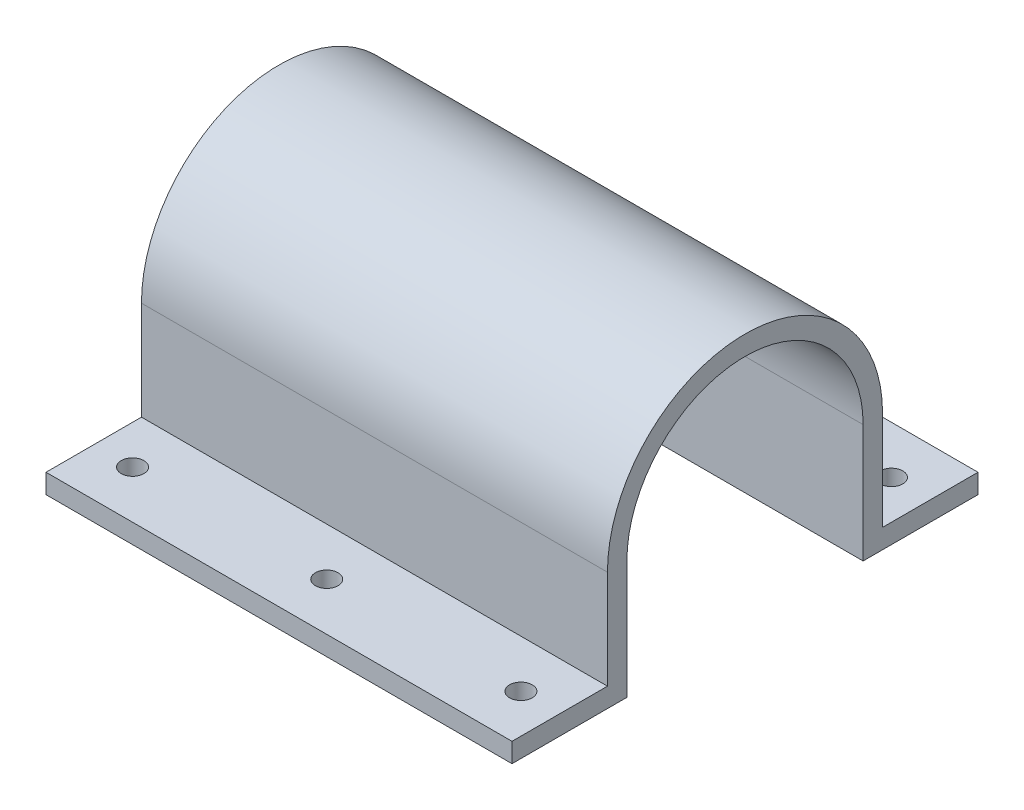
ISO-10303-21;
HEADER;
FILE_DESCRIPTION(('STEP AP214'),'2;1');
FILE_NAME('part.step','',(''),(''),'','','');
FILE_SCHEMA(('AUTOMOTIVE_DESIGN { 1 0 10303 214 1 1 1 1 }'));
ENDSEC;
DATA;
#1=APPLICATION_CONTEXT('core data for automotive mechanical design processes');
#2=APPLICATION_PROTOCOL_DEFINITION('international standard','automotive_design',2000,#1);
#3=PRODUCT_CONTEXT('',#1,'mechanical');
#4=PRODUCT('Part','Part','',(#3));
#5=PRODUCT_RELATED_PRODUCT_CATEGORY('part','',(#4));
#6=PRODUCT_DEFINITION_FORMATION('','',#4);
#7=PRODUCT_DEFINITION_CONTEXT('part definition',#1,'design');
#8=PRODUCT_DEFINITION('design','',#6,#7);
#9=PRODUCT_DEFINITION_SHAPE('','',#8);
#10=(LENGTH_UNIT() NAMED_UNIT(*) SI_UNIT(.MILLI.,.METRE.));
#11=(NAMED_UNIT(*) PLANE_ANGLE_UNIT() SI_UNIT($,.RADIAN.));
#12=(NAMED_UNIT(*) SI_UNIT($,.STERADIAN.) SOLID_ANGLE_UNIT());
#13=UNCERTAINTY_MEASURE_WITH_UNIT(LENGTH_MEASURE(1.E-05),#10,'distance_accuracy_value','');
#14=(GEOMETRIC_REPRESENTATION_CONTEXT(3) GLOBAL_UNCERTAINTY_ASSIGNED_CONTEXT((#13)) GLOBAL_UNIT_ASSIGNED_CONTEXT((#10,
#11,#12)) REPRESENTATION_CONTEXT('',''));
#15=CARTESIAN_POINT('',(0.,0.,0.));
#16=DIRECTION('',(0.,0.,1.));
#17=DIRECTION('',(1.,0.,0.));
#18=AXIS2_PLACEMENT_3D('',#15,#16,#17);
#19=CARTESIAN_POINT('',(72.,0.,18.25));
#20=DIRECTION('',(0.,0.,1.));
#21=DIRECTION('',(0.,-1.,0.));
#22=AXIS2_PLACEMENT_3D('',#19,#20,#21);
#23=PLANE('',#22);
#24=DIRECTION('',(0.,1.,0.));
#25=VECTOR('',#24,1.);
#26=CARTESIAN_POINT('',(3.,-18.25,18.25));
#27=LINE('',#26,#25);
#28=CARTESIAN_POINT('',(3.,-18.25,18.25));
#29=VERTEX_POINT('',#28);
#30=CARTESIAN_POINT('',(3.,0.,18.25));
#31=VERTEX_POINT('',#30);
#32=EDGE_CURVE('E55',#29,#31,#27,.T.);
#33=ORIENTED_EDGE('',*,*,#32,.T.);
#34=DIRECTION('',(-1.,0.,0.));
#35=VECTOR('',#34,1.);
#36=CARTESIAN_POINT('',(72.,0.,18.25));
#37=LINE('',#36,#35);
#38=CARTESIAN_POINT('',(72.,0.,18.25));
#39=VERTEX_POINT('',#38);
#40=EDGE_CURVE('E180',#39,#31,#37,.T.);
#41=ORIENTED_EDGE('',*,*,#40,.F.);
#42=DIRECTION('',(0.,1.,0.));
#43=VECTOR('',#42,1.);
#44=CARTESIAN_POINT('',(72.,0.,18.25));
#45=LINE('',#44,#43);
#46=CARTESIAN_POINT('',(72.,-18.25,18.25));
#47=VERTEX_POINT('',#46);
#48=EDGE_CURVE('E216',#47,#39,#45,.T.);
#49=ORIENTED_EDGE('',*,*,#48,.F.);
#50=DIRECTION('',(-1.,0.,0.));
#51=VECTOR('',#50,1.);
#52=CARTESIAN_POINT('',(72.,-18.25,18.25));
#53=LINE('',#52,#51);
#54=EDGE_CURVE('E51',#47,#29,#53,.T.);
#55=ORIENTED_EDGE('',*,*,#54,.T.);
#56=EDGE_LOOP('',(#33,#41,#49,#55));
#57=FACE_BOUND('',#56,.T.);
#58=ADVANCED_FACE('F36',(#57),#23,.F.);
#59=CARTESIAN_POINT('',(72.,0.,0.));
#60=DIRECTION('',(-1.,0.,0.));
#61=DIRECTION('',(0.,0.,1.));
#62=AXIS2_PLACEMENT_3D('',#59,#60,#61);
#63=CYLINDRICAL_SURFACE('',#62,18.25);
#64=CARTESIAN_POINT('',(3.,0.,0.));
#65=DIRECTION('',(-1.,0.,0.));
#66=DIRECTION('',(0.,0.,1.));
#67=AXIS2_PLACEMENT_3D('',#64,#65,#66);
#68=CIRCLE('',#67,18.25);
#69=CARTESIAN_POINT('',(3.,0.,-18.25));
#70=VERTEX_POINT('',#69);
#71=EDGE_CURVE('E159',#31,#70,#68,.T.);
#72=ORIENTED_EDGE('',*,*,#71,.T.);
#73=DIRECTION('',(-1.,0.,0.));
#74=VECTOR('',#73,1.);
#75=CARTESIAN_POINT('',(72.,0.,-18.25));
#76=LINE('',#75,#74);
#77=CARTESIAN_POINT('',(72.,0.,-18.25));
#78=VERTEX_POINT('',#77);
#79=EDGE_CURVE('E177',#78,#70,#76,.T.);
#80=ORIENTED_EDGE('',*,*,#79,.F.);
#81=CARTESIAN_POINT('',(72.,0.,0.));
#82=DIRECTION('',(-1.,0.,0.));
#83=DIRECTION('',(0.,0.,-1.));
#84=AXIS2_PLACEMENT_3D('',#81,#82,#83);
#85=CIRCLE('',#84,18.25);
#86=EDGE_CURVE('E217',#39,#78,#85,.T.);
#87=ORIENTED_EDGE('',*,*,#86,.F.);
#88=ORIENTED_EDGE('',*,*,#40,.T.);
#89=EDGE_LOOP('',(#72,#80,#87,#88));
#90=FACE_BOUND('',#89,.T.);
#91=ADVANCED_FACE('F221',(#90),#63,.F.);
#92=CARTESIAN_POINT('',(72.,0.,-18.25));
#93=DIRECTION('',(0.,0.,-1.));
#94=DIRECTION('',(0.,1.,0.));
#95=AXIS2_PLACEMENT_3D('',#92,#93,#94);
#96=PLANE('',#95);
#97=DIRECTION('',(0.,-1.,0.));
#98=VECTOR('',#97,1.);
#99=CARTESIAN_POINT('',(3.,0.,-18.25));
#100=LINE('',#99,#98);
#101=CARTESIAN_POINT('',(3.,-18.25,-18.25));
#102=VERTEX_POINT('',#101);
#103=EDGE_CURVE('E226',#70,#102,#100,.T.);
#104=ORIENTED_EDGE('',*,*,#103,.T.);
#105=DIRECTION('',(-1.,0.,0.));
#106=VECTOR('',#105,1.);
#107=CARTESIAN_POINT('',(72.,-18.25,-18.25));
#108=LINE('',#107,#106);
#109=CARTESIAN_POINT('',(72.,-18.25,-18.25));
#110=VERTEX_POINT('',#109);
#111=EDGE_CURVE('E175',#110,#102,#108,.T.);
#112=ORIENTED_EDGE('',*,*,#111,.F.);
#113=DIRECTION('',(0.,-1.,0.));
#114=VECTOR('',#113,1.);
#115=CARTESIAN_POINT('',(72.,0.,-18.25));
#116=LINE('',#115,#114);
#117=EDGE_CURVE('E136',#78,#110,#116,.T.);
#118=ORIENTED_EDGE('',*,*,#117,.F.);
#119=ORIENTED_EDGE('',*,*,#79,.T.);
#120=EDGE_LOOP('',(#104,#112,#118,#119));
#121=FACE_BOUND('',#120,.T.);
#122=ADVANCED_FACE('F225',(#121),#96,.F.);
#123=CARTESIAN_POINT('',(72.,-15.25,-36.));
#124=DIRECTION('',(0.,0.,1.));
#125=DIRECTION('',(1.,0.,0.));
#126=AXIS2_PLACEMENT_3D('',#123,#124,#125);
#127=PLANE('',#126);
#128=DIRECTION('',(0.,1.,0.));
#129=VECTOR('',#128,1.);
#130=CARTESIAN_POINT('',(0.,-15.25,-36.));
#131=LINE('',#130,#129);
#132=CARTESIAN_POINT('',(0.,-18.25,-36.));
#133=VERTEX_POINT('',#132);
#134=CARTESIAN_POINT('',(0.,-15.25,-36.));
#135=VERTEX_POINT('',#134);
#136=EDGE_CURVE('E154',#133,#135,#131,.T.);
#137=ORIENTED_EDGE('',*,*,#136,.T.);
#138=DIRECTION('',(-1.,0.,0.));
#139=VECTOR('',#138,1.);
#140=CARTESIAN_POINT('',(72.,-15.25,-36.));
#141=LINE('',#140,#139);
#142=CARTESIAN_POINT('',(72.,-15.25,-36.));
#143=VERTEX_POINT('',#142);
#144=EDGE_CURVE('E44',#143,#135,#141,.T.);
#145=ORIENTED_EDGE('',*,*,#144,.F.);
#146=DIRECTION('',(0.,1.,0.));
#147=VECTOR('',#146,1.);
#148=CARTESIAN_POINT('',(72.,-15.25,-36.));
#149=LINE('',#148,#147);
#150=CARTESIAN_POINT('',(72.,-18.25,-36.));
#151=VERTEX_POINT('',#150);
#152=EDGE_CURVE('E124',#151,#143,#149,.T.);
#153=ORIENTED_EDGE('',*,*,#152,.F.);
#154=DIRECTION('',(-1.,0.,0.));
#155=VECTOR('',#154,1.);
#156=CARTESIAN_POINT('',(72.,-18.25,-36.));
#157=LINE('',#156,#155);
#158=EDGE_CURVE('E11',#151,#133,#157,.T.);
#159=ORIENTED_EDGE('',*,*,#158,.T.);
#160=EDGE_LOOP('',(#137,#145,#153,#159));
#161=FACE_BOUND('',#160,.T.);
#162=ADVANCED_FACE('F38',(#161),#127,.F.);
#163=CARTESIAN_POINT('',(72.,-15.25,-21.25));
#164=DIRECTION('',(0.,-1.,0.));
#165=DIRECTION('',(0.,0.,-1.));
#166=AXIS2_PLACEMENT_3D('',#163,#164,#165);
#167=PLANE('',#166);
#168=CARTESIAN_POINT('',(6.,-15.25,-28.625));
#169=DIRECTION('',(0.,1.,0.));
#170=DIRECTION('',(0.,0.,1.));
#171=AXIS2_PLACEMENT_3D('',#168,#169,#170);
#172=CIRCLE('',#171,1.75);
#173=CARTESIAN_POINT('',(6.,-15.25,-26.875));
#174=VERTEX_POINT('',#173);
#175=EDGE_CURVE('E270',#174,#174,#172,.T.);
#176=ORIENTED_EDGE('',*,*,#175,.F.);
#177=EDGE_LOOP('',(#176));
#178=FACE_BOUND('',#177,.T.);
#179=CARTESIAN_POINT('',(66.,-15.25,-28.625));
#180=DIRECTION('',(0.,1.,0.));
#181=DIRECTION('',(0.,0.,1.));
#182=AXIS2_PLACEMENT_3D('',#179,#180,#181);
#183=CIRCLE('',#182,1.75);
#184=CARTESIAN_POINT('',(66.,-15.25,-26.875));
#185=VERTEX_POINT('',#184);
#186=EDGE_CURVE('E289',#185,#185,#183,.T.);
#187=ORIENTED_EDGE('',*,*,#186,.F.);
#188=EDGE_LOOP('',(#187));
#189=FACE_BOUND('',#188,.T.);
#190=CARTESIAN_POINT('',(36.,-15.25,-28.625));
#191=DIRECTION('',(0.,1.,0.));
#192=DIRECTION('',(0.,0.,1.));
#193=AXIS2_PLACEMENT_3D('',#190,#191,#192);
#194=CIRCLE('',#193,1.75);
#195=CARTESIAN_POINT('',(36.,-15.25,-26.875));
#196=VERTEX_POINT('',#195);
#197=EDGE_CURVE('E267',#196,#196,#194,.T.);
#198=ORIENTED_EDGE('',*,*,#197,.F.);
#199=EDGE_LOOP('',(#198));
#200=FACE_BOUND('',#199,.T.);
#201=DIRECTION('',(0.,0.,1.));
#202=VECTOR('',#201,1.);
#203=CARTESIAN_POINT('',(0.,-15.25,-21.25));
#204=LINE('',#203,#202);
#205=CARTESIAN_POINT('',(0.,-15.25,-21.25));
#206=VERTEX_POINT('',#205);
#207=EDGE_CURVE('E158',#135,#206,#204,.T.);
#208=ORIENTED_EDGE('',*,*,#207,.T.);
#209=DIRECTION('',(-1.,0.,0.));
#210=VECTOR('',#209,1.);
#211=CARTESIAN_POINT('',(72.,-15.25,-21.25));
#212=LINE('',#211,#210);
#213=CARTESIAN_POINT('',(72.,-15.25,-21.25));
#214=VERTEX_POINT('',#213);
#215=EDGE_CURVE('E196',#214,#206,#212,.T.);
#216=ORIENTED_EDGE('',*,*,#215,.F.);
#217=DIRECTION('',(0.,0.,1.));
#218=VECTOR('',#217,1.);
#219=CARTESIAN_POINT('',(72.,-15.25,-21.25));
#220=LINE('',#219,#218);
#221=EDGE_CURVE('E130',#143,#214,#220,.T.);
#222=ORIENTED_EDGE('',*,*,#221,.F.);
#223=ORIENTED_EDGE('',*,*,#144,.T.);
#224=EDGE_LOOP('',(#208,#216,#222,#223));
#225=FACE_BOUND('',#224,.T.);
#226=ADVANCED_FACE('F199',(#178,#189,#200,#225),#167,.F.);
#227=CARTESIAN_POINT('',(72.,0.,-21.25));
#228=DIRECTION('',(0.,0.,1.));
#229=DIRECTION('',(0.,-1.,0.));
#230=AXIS2_PLACEMENT_3D('',#227,#228,#229);
#231=PLANE('',#230);
#232=DIRECTION('',(0.,1.,0.));
#233=VECTOR('',#232,1.);
#234=CARTESIAN_POINT('',(0.,0.,-21.25));
#235=LINE('',#234,#233);
#236=CARTESIAN_POINT('',(0.,0.,-21.25));
#237=VERTEX_POINT('',#236);
#238=EDGE_CURVE('E161',#206,#237,#235,.T.);
#239=ORIENTED_EDGE('',*,*,#238,.T.);
#240=DIRECTION('',(-1.,0.,0.));
#241=VECTOR('',#240,1.);
#242=CARTESIAN_POINT('',(72.,0.,-21.25));
#243=LINE('',#242,#241);
#244=CARTESIAN_POINT('',(72.,0.,-21.25));
#245=VERTEX_POINT('',#244);
#246=EDGE_CURVE('E193',#245,#237,#243,.T.);
#247=ORIENTED_EDGE('',*,*,#246,.F.);
#248=DIRECTION('',(0.,1.,0.));
#249=VECTOR('',#248,1.);
#250=CARTESIAN_POINT('',(72.,0.,-21.25));
#251=LINE('',#250,#249);
#252=EDGE_CURVE('E202',#214,#245,#251,.T.);
#253=ORIENTED_EDGE('',*,*,#252,.F.);
#254=ORIENTED_EDGE('',*,*,#215,.T.);
#255=EDGE_LOOP('',(#239,#247,#253,#254));
#256=FACE_BOUND('',#255,.T.);
#257=ADVANCED_FACE('F328',(#256),#231,.F.);
#258=CARTESIAN_POINT('',(72.,0.,0.));
#259=DIRECTION('',(-1.,0.,0.));
#260=DIRECTION('',(0.,0.,1.));
#261=AXIS2_PLACEMENT_3D('',#258,#259,#260);
#262=CYLINDRICAL_SURFACE('',#261,21.25);
#263=CARTESIAN_POINT('',(0.,0.,0.));
#264=DIRECTION('',(1.,0.,0.));
#265=DIRECTION('',(0.,0.,-1.));
#266=AXIS2_PLACEMENT_3D('',#263,#264,#265);
#267=CIRCLE('',#266,21.25);
#268=CARTESIAN_POINT('',(0.,0.,21.25));
#269=VERTEX_POINT('',#268);
#270=EDGE_CURVE('E168',#237,#269,#267,.T.);
#271=ORIENTED_EDGE('',*,*,#270,.T.);
#272=DIRECTION('',(-1.,0.,0.));
#273=VECTOR('',#272,1.);
#274=CARTESIAN_POINT('',(72.,0.,21.25));
#275=LINE('',#274,#273);
#276=CARTESIAN_POINT('',(72.,0.,21.25));
#277=VERTEX_POINT('',#276);
#278=EDGE_CURVE('E190',#277,#269,#275,.T.);
#279=ORIENTED_EDGE('',*,*,#278,.F.);
#280=CARTESIAN_POINT('',(72.,0.,0.));
#281=DIRECTION('',(1.,0.,0.));
#282=DIRECTION('',(0.,0.,-1.));
#283=AXIS2_PLACEMENT_3D('',#280,#281,#282);
#284=CIRCLE('',#283,21.25);
#285=EDGE_CURVE('E204',#245,#277,#284,.T.);
#286=ORIENTED_EDGE('',*,*,#285,.F.);
#287=ORIENTED_EDGE('',*,*,#246,.T.);
#288=EDGE_LOOP('',(#271,#279,#286,#287));
#289=FACE_BOUND('',#288,.T.);
#290=ADVANCED_FACE('F325',(#289),#262,.T.);
#291=CARTESIAN_POINT('',(72.,0.,21.25));
#292=DIRECTION('',(0.,0.,-1.));
#293=DIRECTION('',(0.,1.,0.));
#294=AXIS2_PLACEMENT_3D('',#291,#292,#293);
#295=PLANE('',#294);
#296=DIRECTION('',(0.,-1.,0.));
#297=VECTOR('',#296,1.);
#298=CARTESIAN_POINT('',(0.,0.,21.25));
#299=LINE('',#298,#297);
#300=CARTESIAN_POINT('',(0.,-15.25,21.25));
#301=VERTEX_POINT('',#300);
#302=EDGE_CURVE('E170',#269,#301,#299,.T.);
#303=ORIENTED_EDGE('',*,*,#302,.T.);
#304=DIRECTION('',(-1.,0.,0.));
#305=VECTOR('',#304,1.);
#306=CARTESIAN_POINT('',(72.,-15.25,21.25));
#307=LINE('',#306,#305);
#308=CARTESIAN_POINT('',(72.,-15.25,21.25));
#309=VERTEX_POINT('',#308);
#310=EDGE_CURVE('E187',#309,#301,#307,.T.);
#311=ORIENTED_EDGE('',*,*,#310,.F.);
#312=DIRECTION('',(0.,-1.,0.));
#313=VECTOR('',#312,1.);
#314=CARTESIAN_POINT('',(72.,0.,21.25));
#315=LINE('',#314,#313);
#316=EDGE_CURVE('E208',#277,#309,#315,.T.);
#317=ORIENTED_EDGE('',*,*,#316,.F.);
#318=ORIENTED_EDGE('',*,*,#278,.T.);
#319=EDGE_LOOP('',(#303,#311,#317,#318));
#320=FACE_BOUND('',#319,.T.);
#321=ADVANCED_FACE('F309',(#320),#295,.F.);
#322=CARTESIAN_POINT('',(72.,-15.25,21.25));
#323=DIRECTION('',(0.,-1.,0.));
#324=DIRECTION('',(0.,0.,-1.));
#325=AXIS2_PLACEMENT_3D('',#322,#323,#324);
#326=PLANE('',#325);
#327=CARTESIAN_POINT('',(66.,-15.25,28.625));
#328=DIRECTION('',(0.,1.,0.));
#329=DIRECTION('',(0.,0.,-1.));
#330=AXIS2_PLACEMENT_3D('',#327,#328,#329);
#331=CIRCLE('',#330,1.75);
#332=CARTESIAN_POINT('',(66.,-15.25,26.875));
#333=VERTEX_POINT('',#332);
#334=EDGE_CURVE('E283',#333,#333,#331,.T.);
#335=ORIENTED_EDGE('',*,*,#334,.F.);
#336=EDGE_LOOP('',(#335));
#337=FACE_BOUND('',#336,.T.);
#338=CARTESIAN_POINT('',(36.,-15.25,28.625));
#339=DIRECTION('',(0.,1.,0.));
#340=DIRECTION('',(0.,0.,-1.));
#341=AXIS2_PLACEMENT_3D('',#338,#339,#340);
#342=CIRCLE('',#341,1.75);
#343=CARTESIAN_POINT('',(36.,-15.25,26.875));
#344=VERTEX_POINT('',#343);
#345=EDGE_CURVE('E276',#344,#344,#342,.T.);
#346=ORIENTED_EDGE('',*,*,#345,.F.);
#347=EDGE_LOOP('',(#346));
#348=FACE_BOUND('',#347,.T.);
#349=CARTESIAN_POINT('',(6.,-15.25,28.625));
#350=DIRECTION('',(0.,1.,0.));
#351=DIRECTION('',(0.,0.,-1.));
#352=AXIS2_PLACEMENT_3D('',#349,#350,#351);
#353=CIRCLE('',#352,1.75);
#354=CARTESIAN_POINT('',(6.,-15.25,26.875));
#355=VERTEX_POINT('',#354);
#356=EDGE_CURVE('E277',#355,#355,#353,.T.);
#357=ORIENTED_EDGE('',*,*,#356,.F.);
#358=EDGE_LOOP('',(#357));
#359=FACE_BOUND('',#358,.T.);
#360=DIRECTION('',(0.,0.,1.));
#361=VECTOR('',#360,1.);
#362=CARTESIAN_POINT('',(0.,-15.25,21.25));
#363=LINE('',#362,#361);
#364=CARTESIAN_POINT('',(0.,-15.25,36.));
#365=VERTEX_POINT('',#364);
#366=EDGE_CURVE('E172',#301,#365,#363,.T.);
#367=ORIENTED_EDGE('',*,*,#366,.T.);
#368=DIRECTION('',(-1.,0.,0.));
#369=VECTOR('',#368,1.);
#370=CARTESIAN_POINT('',(72.,-15.25,36.));
#371=LINE('',#370,#369);
#372=CARTESIAN_POINT('',(72.,-15.25,36.));
#373=VERTEX_POINT('',#372);
#374=EDGE_CURVE('E184',#373,#365,#371,.T.);
#375=ORIENTED_EDGE('',*,*,#374,.F.);
#376=DIRECTION('',(0.,0.,1.));
#377=VECTOR('',#376,1.);
#378=CARTESIAN_POINT('',(72.,-15.25,21.25));
#379=LINE('',#378,#377);
#380=EDGE_CURVE('E210',#309,#373,#379,.T.);
#381=ORIENTED_EDGE('',*,*,#380,.F.);
#382=ORIENTED_EDGE('',*,*,#310,.T.);
#383=EDGE_LOOP('',(#367,#375,#381,#382));
#384=FACE_BOUND('',#383,.T.);
#385=ADVANCED_FACE('F305',(#337,#348,#359,#384),#326,.F.);
#386=CARTESIAN_POINT('',(72.,-15.25,36.));
#387=DIRECTION('',(0.,0.,-1.));
#388=DIRECTION('',(-1.,0.,0.));
#389=AXIS2_PLACEMENT_3D('',#386,#387,#388);
#390=PLANE('',#389);
#391=DIRECTION('',(0.,-1.,0.));
#392=VECTOR('',#391,1.);
#393=CARTESIAN_POINT('',(0.,-15.25,36.));
#394=LINE('',#393,#392);
#395=CARTESIAN_POINT('',(0.,-18.25,36.));
#396=VERTEX_POINT('',#395);
#397=EDGE_CURVE('E151',#365,#396,#394,.T.);
#398=ORIENTED_EDGE('',*,*,#397,.T.);
#399=DIRECTION('',(-1.,0.,0.));
#400=VECTOR('',#399,1.);
#401=CARTESIAN_POINT('',(72.,-18.25,36.));
#402=LINE('',#401,#400);
#403=CARTESIAN_POINT('',(72.,-18.25,36.));
#404=VERTEX_POINT('',#403);
#405=EDGE_CURVE('E148',#404,#396,#402,.T.);
#406=ORIENTED_EDGE('',*,*,#405,.F.);
#407=DIRECTION('',(0.,-1.,0.));
#408=VECTOR('',#407,1.);
#409=CARTESIAN_POINT('',(72.,-15.25,36.));
#410=LINE('',#409,#408);
#411=EDGE_CURVE('E212',#373,#404,#410,.T.);
#412=ORIENTED_EDGE('',*,*,#411,.F.);
#413=ORIENTED_EDGE('',*,*,#374,.T.);
#414=EDGE_LOOP('',(#398,#406,#412,#413));
#415=FACE_BOUND('',#414,.T.);
#416=ADVANCED_FACE('F308',(#415),#390,.F.);
#417=CARTESIAN_POINT('',(72.,-18.25,36.));
#418=DIRECTION('',(0.,1.,0.));
#419=DIRECTION('',(0.,0.,1.));
#420=AXIS2_PLACEMENT_3D('',#417,#418,#419);
#421=PLANE('',#420);
#422=CARTESIAN_POINT('',(6.,-18.25,-28.625));
#423=DIRECTION('',(0.,1.,0.));
#424=DIRECTION('',(0.,0.,1.));
#425=AXIS2_PLACEMENT_3D('',#422,#423,#424);
#426=CIRCLE('',#425,1.75);
#427=CARTESIAN_POINT('',(6.,-18.25,-26.875));
#428=VERTEX_POINT('',#427);
#429=EDGE_CURVE('E292',#428,#428,#426,.T.);
#430=ORIENTED_EDGE('',*,*,#429,.T.);
#431=EDGE_LOOP('',(#430));
#432=FACE_BOUND('',#431,.T.);
#433=CARTESIAN_POINT('',(66.,-18.25,-28.625));
#434=DIRECTION('',(0.,1.,0.));
#435=DIRECTION('',(0.,0.,1.));
#436=AXIS2_PLACEMENT_3D('',#433,#434,#435);
#437=CIRCLE('',#436,1.75);
#438=CARTESIAN_POINT('',(66.,-18.25,-26.875));
#439=VERTEX_POINT('',#438);
#440=EDGE_CURVE('E286',#439,#439,#437,.T.);
#441=ORIENTED_EDGE('',*,*,#440,.T.);
#442=EDGE_LOOP('',(#441));
#443=FACE_BOUND('',#442,.T.);
#444=CARTESIAN_POINT('',(66.,-18.25,28.625));
#445=DIRECTION('',(0.,1.,0.));
#446=DIRECTION('',(0.,0.,-1.));
#447=AXIS2_PLACEMENT_3D('',#444,#445,#446);
#448=CIRCLE('',#447,1.75);
#449=CARTESIAN_POINT('',(66.,-18.25,26.875));
#450=VERTEX_POINT('',#449);
#451=EDGE_CURVE('E280',#450,#450,#448,.T.);
#452=ORIENTED_EDGE('',*,*,#451,.T.);
#453=EDGE_LOOP('',(#452));
#454=FACE_BOUND('',#453,.T.);
#455=CARTESIAN_POINT('',(36.,-18.25,28.625));
#456=DIRECTION('',(0.,1.,0.));
#457=DIRECTION('',(0.,0.,-1.));
#458=AXIS2_PLACEMENT_3D('',#455,#456,#457);
#459=CIRCLE('',#458,1.75);
#460=CARTESIAN_POINT('',(36.,-18.25,26.875));
#461=VERTEX_POINT('',#460);
#462=EDGE_CURVE('E273',#461,#461,#459,.T.);
#463=ORIENTED_EDGE('',*,*,#462,.T.);
#464=EDGE_LOOP('',(#463));
#465=FACE_BOUND('',#464,.T.);
#466=CARTESIAN_POINT('',(6.,-18.25,28.625));
#467=DIRECTION('',(0.,1.,0.));
#468=DIRECTION('',(0.,0.,-1.));
#469=AXIS2_PLACEMENT_3D('',#466,#467,#468);
#470=CIRCLE('',#469,1.75);
#471=CARTESIAN_POINT('',(6.,-18.25,26.875));
#472=VERTEX_POINT('',#471);
#473=EDGE_CURVE('E297',#472,#472,#470,.T.);
#474=ORIENTED_EDGE('',*,*,#473,.T.);
#475=EDGE_LOOP('',(#474));
#476=FACE_BOUND('',#475,.T.);
#477=CARTESIAN_POINT('',(36.,-18.25,-28.625));
#478=DIRECTION('',(0.,1.,0.));
#479=DIRECTION('',(0.,0.,1.));
#480=AXIS2_PLACEMENT_3D('',#477,#478,#479);
#481=CIRCLE('',#480,1.75);
#482=CARTESIAN_POINT('',(36.,-18.25,-26.875));
#483=VERTEX_POINT('',#482);
#484=EDGE_CURVE('E264',#483,#483,#481,.T.);
#485=ORIENTED_EDGE('',*,*,#484,.T.);
#486=EDGE_LOOP('',(#485));
#487=FACE_BOUND('',#486,.T.);
#488=DIRECTION('',(0.,0.,-1.));
#489=VECTOR('',#488,1.);
#490=CARTESIAN_POINT('',(0.,-18.25,36.));
#491=LINE('',#490,#489);
#492=EDGE_CURVE('E140',#396,#133,#491,.T.);
#493=ORIENTED_EDGE('',*,*,#492,.T.);
#494=ORIENTED_EDGE('',*,*,#158,.F.);
#495=DIRECTION('',(0.,0.,-1.));
#496=VECTOR('',#495,1.);
#497=CARTESIAN_POINT('',(72.,-18.25,-36.));
#498=LINE('',#497,#496);
#499=EDGE_CURVE('E131',#110,#151,#498,.T.);
#500=ORIENTED_EDGE('',*,*,#499,.F.);
#501=ORIENTED_EDGE('',*,*,#111,.T.);
#502=DIRECTION('',(0.,0.,1.));
#503=VECTOR('',#502,1.);
#504=CARTESIAN_POINT('',(3.,-18.25,-18.25));
#505=LINE('',#504,#503);
#506=EDGE_CURVE('E229',#102,#29,#505,.T.);
#507=ORIENTED_EDGE('',*,*,#506,.T.);
#508=ORIENTED_EDGE('',*,*,#54,.F.);
#509=DIRECTION('',(0.,0.,-1.));
#510=VECTOR('',#509,1.);
#511=CARTESIAN_POINT('',(72.,-18.25,36.));
#512=LINE('',#511,#510);
#513=EDGE_CURVE('E214',#404,#47,#512,.T.);
#514=ORIENTED_EDGE('',*,*,#513,.F.);
#515=ORIENTED_EDGE('',*,*,#405,.T.);
#516=EDGE_LOOP('',(#493,#494,#500,#501,#507,#508,#514,#515));
#517=FACE_BOUND('',#516,.T.);
#518=ADVANCED_FACE('F142',(#432,#443,#454,#465,#476,#487,#517),#421,.F.);
#519=CARTESIAN_POINT('',(72.,0.,0.));
#520=DIRECTION('',(1.,0.,0.));
#521=DIRECTION('',(0.,0.,-1.));
#522=AXIS2_PLACEMENT_3D('',#519,#520,#521);
#523=PLANE('',#522);
#524=ORIENTED_EDGE('',*,*,#499,.T.);
#525=ORIENTED_EDGE('',*,*,#152,.T.);
#526=ORIENTED_EDGE('',*,*,#221,.T.);
#527=ORIENTED_EDGE('',*,*,#252,.T.);
#528=ORIENTED_EDGE('',*,*,#285,.T.);
#529=ORIENTED_EDGE('',*,*,#316,.T.);
#530=ORIENTED_EDGE('',*,*,#380,.T.);
#531=ORIENTED_EDGE('',*,*,#411,.T.);
#532=ORIENTED_EDGE('',*,*,#513,.T.);
#533=ORIENTED_EDGE('',*,*,#48,.T.);
#534=ORIENTED_EDGE('',*,*,#86,.T.);
#535=ORIENTED_EDGE('',*,*,#117,.T.);
#536=EDGE_LOOP('',(#524,#525,#526,#527,#528,#529,#530,#531,#532,#533,#534,#535));
#537=FACE_BOUND('',#536,.T.);
#538=ADVANCED_FACE('F134',(#537),#523,.T.);
#539=CARTESIAN_POINT('',(0.,0.,0.));
#540=DIRECTION('',(1.,0.,0.));
#541=DIRECTION('',(0.,0.,-1.));
#542=AXIS2_PLACEMENT_3D('',#539,#540,#541);
#543=PLANE('',#542);
#544=ORIENTED_EDGE('',*,*,#136,.F.);
#545=ORIENTED_EDGE('',*,*,#492,.F.);
#546=ORIENTED_EDGE('',*,*,#397,.F.);
#547=ORIENTED_EDGE('',*,*,#366,.F.);
#548=ORIENTED_EDGE('',*,*,#302,.F.);
#549=ORIENTED_EDGE('',*,*,#270,.F.);
#550=ORIENTED_EDGE('',*,*,#238,.F.);
#551=ORIENTED_EDGE('',*,*,#207,.F.);
#552=EDGE_LOOP('',(#544,#545,#546,#547,#548,#549,#550,#551));
#553=FACE_BOUND('',#552,.T.);
#554=CARTESIAN_POINT('',(0.,-15.,0.));
#555=DIRECTION('',(-1.,0.,0.));
#556=DIRECTION('',(0.,0.,1.));
#557=AXIS2_PLACEMENT_3D('',#554,#555,#556);
#558=CIRCLE('',#557,1.75);
#559=CARTESIAN_POINT('',(0.,-15.,1.74999999999995));
#560=VERTEX_POINT('',#559);
#561=EDGE_CURVE('E261',#560,#560,#558,.T.);
#562=ORIENTED_EDGE('',*,*,#561,.F.);
#563=EDGE_LOOP('',(#562));
#564=FACE_BOUND('',#563,.T.);
#565=CARTESIAN_POINT('',(0.,0.,15.));
#566=DIRECTION('',(-1.,0.,0.));
#567=DIRECTION('',(0.,0.,1.));
#568=AXIS2_PLACEMENT_3D('',#565,#566,#567);
#569=CIRCLE('',#568,1.75);
#570=CARTESIAN_POINT('',(0.,0.,16.75));
#571=VERTEX_POINT('',#570);
#572=EDGE_CURVE('E255',#571,#571,#569,.T.);
#573=ORIENTED_EDGE('',*,*,#572,.F.);
#574=EDGE_LOOP('',(#573));
#575=FACE_BOUND('',#574,.T.);
#576=CARTESIAN_POINT('',(0.,15.,0.));
#577=DIRECTION('',(-1.,0.,0.));
#578=DIRECTION('',(0.,0.,1.));
#579=AXIS2_PLACEMENT_3D('',#576,#577,#578);
#580=CIRCLE('',#579,1.75);
#581=CARTESIAN_POINT('',(0.,15.,1.75000000000005));
#582=VERTEX_POINT('',#581);
#583=EDGE_CURVE('E249',#582,#582,#580,.T.);
#584=ORIENTED_EDGE('',*,*,#583,.F.);
#585=EDGE_LOOP('',(#584));
#586=FACE_BOUND('',#585,.T.);
#587=CARTESIAN_POINT('',(0.,0.,-15.));
#588=DIRECTION('',(-1.,0.,0.));
#589=DIRECTION('',(0.,0.,1.));
#590=AXIS2_PLACEMENT_3D('',#587,#588,#589);
#591=CIRCLE('',#590,1.75);
#592=CARTESIAN_POINT('',(0.,0.,-13.25));
#593=VERTEX_POINT('',#592);
#594=EDGE_CURVE('E243',#593,#593,#591,.T.);
#595=ORIENTED_EDGE('',*,*,#594,.F.);
#596=EDGE_LOOP('',(#595));
#597=FACE_BOUND('',#596,.T.);
#598=CARTESIAN_POINT('',(0.,0.,0.));
#599=DIRECTION('',(-1.,0.,0.));
#600=DIRECTION('',(0.,0.,1.));
#601=AXIS2_PLACEMENT_3D('',#598,#599,#600);
#602=CIRCLE('',#601,11.25);
#603=CARTESIAN_POINT('',(0.,0.,11.25));
#604=VERTEX_POINT('',#603);
#605=EDGE_CURVE('E237',#604,#604,#602,.T.);
#606=ORIENTED_EDGE('',*,*,#605,.F.);
#607=EDGE_LOOP('',(#606));
#608=FACE_BOUND('',#607,.T.);
#609=ADVANCED_FACE('F155',(#553,#564,#575,#586,#597,#608),#543,.F.);
#610=CARTESIAN_POINT('',(3.,0.,0.));
#611=DIRECTION('',(-1.,0.,0.));
#612=DIRECTION('',(0.,0.,1.));
#613=AXIS2_PLACEMENT_3D('',#610,#611,#612);
#614=PLANE('',#613);
#615=CARTESIAN_POINT('',(3.,-15.,0.));
#616=DIRECTION('',(-1.,0.,0.));
#617=DIRECTION('',(0.,0.,1.));
#618=AXIS2_PLACEMENT_3D('',#615,#616,#617);
#619=CIRCLE('',#618,1.75);
#620=CARTESIAN_POINT('',(3.,-15.,1.74999999999995));
#621=VERTEX_POINT('',#620);
#622=EDGE_CURVE('E258',#621,#621,#619,.T.);
#623=ORIENTED_EDGE('',*,*,#622,.T.);
#624=EDGE_LOOP('',(#623));
#625=FACE_BOUND('',#624,.T.);
#626=CARTESIAN_POINT('',(3.,0.,15.));
#627=DIRECTION('',(-1.,0.,0.));
#628=DIRECTION('',(0.,0.,1.));
#629=AXIS2_PLACEMENT_3D('',#626,#627,#628);
#630=CIRCLE('',#629,1.75);
#631=CARTESIAN_POINT('',(3.,0.,16.75));
#632=VERTEX_POINT('',#631);
#633=EDGE_CURVE('E252',#632,#632,#630,.T.);
#634=ORIENTED_EDGE('',*,*,#633,.T.);
#635=EDGE_LOOP('',(#634));
#636=FACE_BOUND('',#635,.T.);
#637=CARTESIAN_POINT('',(3.,15.,0.));
#638=DIRECTION('',(-1.,0.,0.));
#639=DIRECTION('',(0.,0.,1.));
#640=AXIS2_PLACEMENT_3D('',#637,#638,#639);
#641=CIRCLE('',#640,1.75);
#642=CARTESIAN_POINT('',(3.,15.,1.75000000000005));
#643=VERTEX_POINT('',#642);
#644=EDGE_CURVE('E246',#643,#643,#641,.T.);
#645=ORIENTED_EDGE('',*,*,#644,.T.);
#646=EDGE_LOOP('',(#645));
#647=FACE_BOUND('',#646,.T.);
#648=CARTESIAN_POINT('',(3.,0.,-15.));
#649=DIRECTION('',(-1.,0.,0.));
#650=DIRECTION('',(0.,0.,1.));
#651=AXIS2_PLACEMENT_3D('',#648,#649,#650);
#652=CIRCLE('',#651,1.75);
#653=CARTESIAN_POINT('',(3.,0.,-13.25));
#654=VERTEX_POINT('',#653);
#655=EDGE_CURVE('E240',#654,#654,#652,.T.);
#656=ORIENTED_EDGE('',*,*,#655,.T.);
#657=EDGE_LOOP('',(#656));
#658=FACE_BOUND('',#657,.T.);
#659=CARTESIAN_POINT('',(3.,0.,0.));
#660=DIRECTION('',(-1.,0.,0.));
#661=DIRECTION('',(0.,0.,1.));
#662=AXIS2_PLACEMENT_3D('',#659,#660,#661);
#663=CIRCLE('',#662,11.25);
#664=CARTESIAN_POINT('',(3.,0.,11.25));
#665=VERTEX_POINT('',#664);
#666=EDGE_CURVE('E234',#665,#665,#663,.T.);
#667=ORIENTED_EDGE('',*,*,#666,.T.);
#668=EDGE_LOOP('',(#667));
#669=FACE_BOUND('',#668,.T.);
#670=ORIENTED_EDGE('',*,*,#103,.F.);
#671=ORIENTED_EDGE('',*,*,#71,.F.);
#672=ORIENTED_EDGE('',*,*,#32,.F.);
#673=ORIENTED_EDGE('',*,*,#506,.F.);
#674=EDGE_LOOP('',(#670,#671,#672,#673));
#675=FACE_BOUND('',#674,.T.);
#676=ADVANCED_FACE('F231',(#625,#636,#647,#658,#669,#675),#614,.F.);
#677=CARTESIAN_POINT('',(3.,0.,0.));
#678=DIRECTION('',(-1.,0.,0.));
#679=DIRECTION('',(0.,0.,1.));
#680=AXIS2_PLACEMENT_3D('',#677,#678,#679);
#681=CYLINDRICAL_SURFACE('',#680,11.25);
#682=ORIENTED_EDGE('',*,*,#666,.F.);
#683=EDGE_LOOP('',(#682));
#684=FACE_BOUND('',#683,.T.);
#685=ORIENTED_EDGE('',*,*,#605,.T.);
#686=EDGE_LOOP('',(#685));
#687=FACE_BOUND('',#686,.T.);
#688=ADVANCED_FACE('F388',(#684,#687),#681,.F.);
#689=CARTESIAN_POINT('',(3.,0.,-15.));
#690=DIRECTION('',(-1.,0.,0.));
#691=DIRECTION('',(0.,0.,1.));
#692=AXIS2_PLACEMENT_3D('',#689,#690,#691);
#693=CYLINDRICAL_SURFACE('',#692,1.75);
#694=ORIENTED_EDGE('',*,*,#655,.F.);
#695=EDGE_LOOP('',(#694));
#696=FACE_BOUND('',#695,.T.);
#697=ORIENTED_EDGE('',*,*,#594,.T.);
#698=EDGE_LOOP('',(#697));
#699=FACE_BOUND('',#698,.T.);
#700=ADVANCED_FACE('F396',(#696,#699),#693,.F.);
#701=CARTESIAN_POINT('',(3.,15.,0.));
#702=DIRECTION('',(-1.,0.,0.));
#703=DIRECTION('',(0.,0.,1.));
#704=AXIS2_PLACEMENT_3D('',#701,#702,#703);
#705=CYLINDRICAL_SURFACE('',#704,1.75);
#706=ORIENTED_EDGE('',*,*,#644,.F.);
#707=EDGE_LOOP('',(#706));
#708=FACE_BOUND('',#707,.T.);
#709=ORIENTED_EDGE('',*,*,#583,.T.);
#710=EDGE_LOOP('',(#709));
#711=FACE_BOUND('',#710,.T.);
#712=ADVANCED_FACE('F404',(#708,#711),#705,.F.);
#713=CARTESIAN_POINT('',(3.,0.,15.));
#714=DIRECTION('',(-1.,0.,0.));
#715=DIRECTION('',(0.,0.,1.));
#716=AXIS2_PLACEMENT_3D('',#713,#714,#715);
#717=CYLINDRICAL_SURFACE('',#716,1.75);
#718=ORIENTED_EDGE('',*,*,#633,.F.);
#719=EDGE_LOOP('',(#718));
#720=FACE_BOUND('',#719,.T.);
#721=ORIENTED_EDGE('',*,*,#572,.T.);
#722=EDGE_LOOP('',(#721));
#723=FACE_BOUND('',#722,.T.);
#724=ADVANCED_FACE('F412',(#720,#723),#717,.F.);
#725=CARTESIAN_POINT('',(3.,-15.,0.));
#726=DIRECTION('',(-1.,0.,0.));
#727=DIRECTION('',(0.,0.,1.));
#728=AXIS2_PLACEMENT_3D('',#725,#726,#727);
#729=CYLINDRICAL_SURFACE('',#728,1.75);
#730=ORIENTED_EDGE('',*,*,#622,.F.);
#731=EDGE_LOOP('',(#730));
#732=FACE_BOUND('',#731,.T.);
#733=ORIENTED_EDGE('',*,*,#561,.T.);
#734=EDGE_LOOP('',(#733));
#735=FACE_BOUND('',#734,.T.);
#736=ADVANCED_FACE('F420',(#732,#735),#729,.F.);
#737=CARTESIAN_POINT('',(36.,-18.25,-28.625));
#738=DIRECTION('',(0.,1.,0.));
#739=DIRECTION('',(0.,0.,1.));
#740=AXIS2_PLACEMENT_3D('',#737,#738,#739);
#741=CYLINDRICAL_SURFACE('',#740,1.75);
#742=ORIENTED_EDGE('',*,*,#484,.F.);
#743=EDGE_LOOP('',(#742));
#744=FACE_BOUND('',#743,.T.);
#745=ORIENTED_EDGE('',*,*,#197,.T.);
#746=EDGE_LOOP('',(#745));
#747=FACE_BOUND('',#746,.T.);
#748=ADVANCED_FACE('F428',(#744,#747),#741,.F.);
#749=CARTESIAN_POINT('',(6.,-18.25,28.625));
#750=DIRECTION('',(0.,1.,0.));
#751=DIRECTION('',(0.,0.,1.));
#752=AXIS2_PLACEMENT_3D('',#749,#750,#751);
#753=CYLINDRICAL_SURFACE('',#752,1.75);
#754=ORIENTED_EDGE('',*,*,#473,.F.);
#755=EDGE_LOOP('',(#754));
#756=FACE_BOUND('',#755,.T.);
#757=ORIENTED_EDGE('',*,*,#356,.T.);
#758=EDGE_LOOP('',(#757));
#759=FACE_BOUND('',#758,.T.);
#760=ADVANCED_FACE('F303',(#756,#759),#753,.F.);
#761=CARTESIAN_POINT('',(36.,-18.25,28.625));
#762=DIRECTION('',(0.,1.,0.));
#763=DIRECTION('',(0.,0.,1.));
#764=AXIS2_PLACEMENT_3D('',#761,#762,#763);
#765=CYLINDRICAL_SURFACE('',#764,1.75);
#766=ORIENTED_EDGE('',*,*,#462,.F.);
#767=EDGE_LOOP('',(#766));
#768=FACE_BOUND('',#767,.T.);
#769=ORIENTED_EDGE('',*,*,#345,.T.);
#770=EDGE_LOOP('',(#769));
#771=FACE_BOUND('',#770,.T.);
#772=ADVANCED_FACE('F442',(#768,#771),#765,.F.);
#773=CARTESIAN_POINT('',(66.,-18.25,28.625));
#774=DIRECTION('',(0.,1.,0.));
#775=DIRECTION('',(0.,0.,1.));
#776=AXIS2_PLACEMENT_3D('',#773,#774,#775);
#777=CYLINDRICAL_SURFACE('',#776,1.75);
#778=ORIENTED_EDGE('',*,*,#451,.F.);
#779=EDGE_LOOP('',(#778));
#780=FACE_BOUND('',#779,.T.);
#781=ORIENTED_EDGE('',*,*,#334,.T.);
#782=EDGE_LOOP('',(#781));
#783=FACE_BOUND('',#782,.T.);
#784=ADVANCED_FACE('F450',(#780,#783),#777,.F.);
#785=CARTESIAN_POINT('',(66.,-18.25,-28.625));
#786=DIRECTION('',(0.,1.,0.));
#787=DIRECTION('',(0.,0.,1.));
#788=AXIS2_PLACEMENT_3D('',#785,#786,#787);
#789=CYLINDRICAL_SURFACE('',#788,1.75);
#790=ORIENTED_EDGE('',*,*,#440,.F.);
#791=EDGE_LOOP('',(#790));
#792=FACE_BOUND('',#791,.T.);
#793=ORIENTED_EDGE('',*,*,#186,.T.);
#794=EDGE_LOOP('',(#793));
#795=FACE_BOUND('',#794,.T.);
#796=ADVANCED_FACE('F458',(#792,#795),#789,.F.);
#797=CARTESIAN_POINT('',(6.,-18.25,-28.625));
#798=DIRECTION('',(0.,1.,0.));
#799=DIRECTION('',(0.,0.,1.));
#800=AXIS2_PLACEMENT_3D('',#797,#798,#799);
#801=CYLINDRICAL_SURFACE('',#800,1.75);
#802=ORIENTED_EDGE('',*,*,#429,.F.);
#803=EDGE_LOOP('',(#802));
#804=FACE_BOUND('',#803,.T.);
#805=ORIENTED_EDGE('',*,*,#175,.T.);
#806=EDGE_LOOP('',(#805));
#807=FACE_BOUND('',#806,.T.);
#808=ADVANCED_FACE('F466',(#804,#807),#801,.F.);
#809=CLOSED_SHELL('',(#58,#91,#122,#162,#226,#257,#290,#321,#385,#416,#518,#538,#609,#676,#688,
#700,#712,#724,#736,#748,#760,#772,#784,#796,#808));
#810=MANIFOLD_SOLID_BREP('B2',#809);
#811=ADVANCED_BREP_SHAPE_REPRESENTATION('',(#18,#810),#14);
#812=SHAPE_DEFINITION_REPRESENTATION(#9,#811);
ENDSEC;
END-ISO-10303-21;
